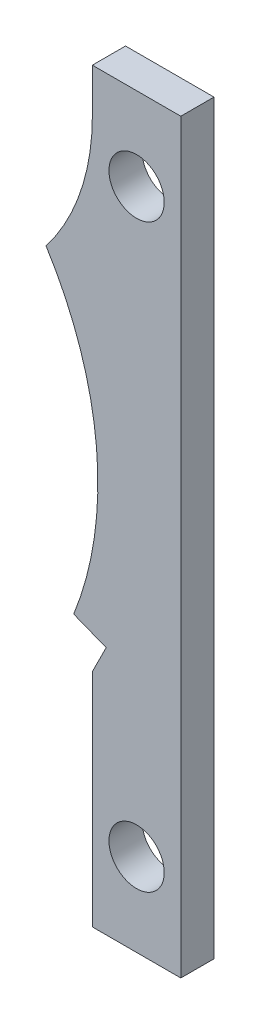
ISO-10303-21;
HEADER;
FILE_DESCRIPTION(('STEP AP214'),'2;1');
FILE_NAME('part.step','',(''),(''),'','','');
FILE_SCHEMA(('AUTOMOTIVE_DESIGN { 1 0 10303 214 1 1 1 1 }'));
ENDSEC;
DATA;
#1=APPLICATION_CONTEXT('core data for automotive mechanical design processes');
#2=APPLICATION_PROTOCOL_DEFINITION('international standard','automotive_design',2000,#1);
#3=PRODUCT_CONTEXT('',#1,'mechanical');
#4=PRODUCT('Part','Part','',(#3));
#5=PRODUCT_RELATED_PRODUCT_CATEGORY('part','',(#4));
#6=PRODUCT_DEFINITION_FORMATION('','',#4);
#7=PRODUCT_DEFINITION_CONTEXT('part definition',#1,'design');
#8=PRODUCT_DEFINITION('design','',#6,#7);
#9=PRODUCT_DEFINITION_SHAPE('','',#8);
#10=(LENGTH_UNIT() NAMED_UNIT(*) SI_UNIT(.MILLI.,.METRE.));
#11=(NAMED_UNIT(*) PLANE_ANGLE_UNIT() SI_UNIT($,.RADIAN.));
#12=(NAMED_UNIT(*) SI_UNIT($,.STERADIAN.) SOLID_ANGLE_UNIT());
#13=UNCERTAINTY_MEASURE_WITH_UNIT(LENGTH_MEASURE(1.E-05),#10,'distance_accuracy_value','');
#14=(GEOMETRIC_REPRESENTATION_CONTEXT(3) GLOBAL_UNCERTAINTY_ASSIGNED_CONTEXT((#13)) GLOBAL_UNIT_ASSIGNED_CONTEXT((#10,
#11,#12)) REPRESENTATION_CONTEXT('',''));
#15=CARTESIAN_POINT('',(0.,0.,0.));
#16=DIRECTION('',(0.,0.,1.));
#17=DIRECTION('',(1.,0.,0.));
#18=AXIS2_PLACEMENT_3D('',#15,#16,#17);
#19=CARTESIAN_POINT('',(62.5,-25.,3.));
#20=DIRECTION('',(0.367557346586308,0.930000858585858,0.));
#21=DIRECTION('',(-0.930000858585858,0.367557346586308,0.));
#22=AXIS2_PLACEMENT_3D('',#19,#20,#21);
#23=PLANE('',#22);
#24=DIRECTION('',(0.930000858585858,-0.367557346586308,0.));
#25=VECTOR('',#24,1.);
#26=CARTESIAN_POINT('',(62.5,-25.,-3.));
#27=LINE('',#26,#25);
#28=CARTESIAN_POINT('',(56.6273985543233,-22.6790152557342,-3.));
#29=VERTEX_POINT('',#28);
#30=CARTESIAN_POINT('',(62.5,-25.,-3.));
#31=VERTEX_POINT('',#30);
#32=EDGE_CURVE('E88',#29,#31,#27,.T.);
#33=ORIENTED_EDGE('',*,*,#32,.T.);
#34=DIRECTION('',(0.,0.,-1.));
#35=VECTOR('',#34,1.);
#36=CARTESIAN_POINT('',(62.5,-25.,3.));
#37=LINE('',#36,#35);
#38=CARTESIAN_POINT('',(62.5,-25.,3.));
#39=VERTEX_POINT('',#38);
#40=EDGE_CURVE('E11',#39,#31,#37,.T.);
#41=ORIENTED_EDGE('',*,*,#40,.F.);
#42=DIRECTION('',(0.930000858585858,-0.367557346586309,0.));
#43=VECTOR('',#42,1.);
#44=CARTESIAN_POINT('',(60.,-24.0119435288877,3.));
#45=LINE('',#44,#43);
#46=CARTESIAN_POINT('',(56.6273985543233,-22.6790152557342,3.));
#47=VERTEX_POINT('',#46);
#48=EDGE_CURVE('E94',#47,#39,#45,.T.);
#49=ORIENTED_EDGE('',*,*,#48,.F.);
#50=DIRECTION('',(0.,0.,-1.));
#51=VECTOR('',#50,1.);
#52=CARTESIAN_POINT('',(56.6273985543233,-22.6790152557342,3.));
#53=LINE('',#52,#51);
#54=EDGE_CURVE('E130',#47,#29,#53,.T.);
#55=ORIENTED_EDGE('',*,*,#54,.T.);
#56=EDGE_LOOP('',(#33,#41,#49,#55));
#57=FACE_BOUND('',#56,.T.);
#58=ADVANCED_FACE('F33',(#57),#23,.F.);
#59=CARTESIAN_POINT('',(62.5,-25.,3.));
#60=DIRECTION('',(0.894427190999915,-0.447213595499959,0.));
#61=DIRECTION('',(0.447213595499959,0.894427190999915,0.));
#62=AXIS2_PLACEMENT_3D('',#59,#60,#61);
#63=PLANE('',#62);
#64=DIRECTION('',(-0.447213595499959,-0.894427190999915,0.));
#65=VECTOR('',#64,1.);
#66=CARTESIAN_POINT('',(62.5,-25.,-3.));
#67=LINE('',#66,#65);
#68=CARTESIAN_POINT('',(60.,-30.,-3.));
#69=VERTEX_POINT('',#68);
#70=EDGE_CURVE('E135',#31,#69,#67,.T.);
#71=ORIENTED_EDGE('',*,*,#70,.T.);
#72=DIRECTION('',(0.,0.,-1.));
#73=VECTOR('',#72,1.);
#74=CARTESIAN_POINT('',(60.,-30.,3.));
#75=LINE('',#74,#73);
#76=CARTESIAN_POINT('',(60.,-30.,3.));
#77=VERTEX_POINT('',#76);
#78=EDGE_CURVE('E41',#77,#69,#75,.T.);
#79=ORIENTED_EDGE('',*,*,#78,.F.);
#80=DIRECTION('',(-0.447213595499959,-0.894427190999915,0.));
#81=VECTOR('',#80,1.);
#82=CARTESIAN_POINT('',(62.5,-25.,3.));
#83=LINE('',#82,#81);
#84=EDGE_CURVE('E191',#39,#77,#83,.T.);
#85=ORIENTED_EDGE('',*,*,#84,.F.);
#86=ORIENTED_EDGE('',*,*,#40,.T.);
#87=EDGE_LOOP('',(#71,#79,#85,#86));
#88=FACE_BOUND('',#87,.T.);
#89=ADVANCED_FACE('F228',(#88),#63,.F.);
#90=CARTESIAN_POINT('',(60.,-30.,3.));
#91=DIRECTION('',(1.,0.,0.));
#92=DIRECTION('',(0.,1.,0.));
#93=AXIS2_PLACEMENT_3D('',#90,#91,#92);
#94=PLANE('',#93);
#95=DIRECTION('',(0.,-1.,0.));
#96=VECTOR('',#95,1.);
#97=CARTESIAN_POINT('',(60.,-30.,-3.));
#98=LINE('',#97,#96);
#99=CARTESIAN_POINT('',(60.,-70.,-3.));
#100=VERTEX_POINT('',#99);
#101=EDGE_CURVE('E138',#69,#100,#98,.T.);
#102=ORIENTED_EDGE('',*,*,#101,.T.);
#103=DIRECTION('',(0.,0.,-1.));
#104=VECTOR('',#103,1.);
#105=CARTESIAN_POINT('',(60.,-70.,3.));
#106=LINE('',#105,#104);
#107=CARTESIAN_POINT('',(60.,-70.,3.));
#108=VERTEX_POINT('',#107);
#109=EDGE_CURVE('E162',#108,#100,#106,.T.);
#110=ORIENTED_EDGE('',*,*,#109,.F.);
#111=DIRECTION('',(0.,-1.,0.));
#112=VECTOR('',#111,1.);
#113=CARTESIAN_POINT('',(60.,-30.,3.));
#114=LINE('',#113,#112);
#115=EDGE_CURVE('E171',#77,#108,#114,.T.);
#116=ORIENTED_EDGE('',*,*,#115,.F.);
#117=ORIENTED_EDGE('',*,*,#78,.T.);
#118=EDGE_LOOP('',(#102,#110,#116,#117));
#119=FACE_BOUND('',#118,.T.);
#120=ADVANCED_FACE('F169',(#119),#94,.F.);
#121=CARTESIAN_POINT('',(60.,-70.,3.));
#122=DIRECTION('',(0.,1.,0.));
#123=DIRECTION('',(0.,0.,1.));
#124=AXIS2_PLACEMENT_3D('',#121,#122,#123);
#125=PLANE('',#124);
#126=DIRECTION('',(1.,0.,0.));
#127=VECTOR('',#126,1.);
#128=CARTESIAN_POINT('',(60.,-70.,-3.));
#129=LINE('',#128,#127);
#130=CARTESIAN_POINT('',(75.9999970794949,-70.,-3.));
#131=VERTEX_POINT('',#130);
#132=EDGE_CURVE('E140',#100,#131,#129,.T.);
#133=ORIENTED_EDGE('',*,*,#132,.T.);
#134=DIRECTION('',(0.,0.,-1.));
#135=VECTOR('',#134,1.);
#136=CARTESIAN_POINT('',(75.9999970794949,-70.,3.));
#137=LINE('',#136,#135);
#138=CARTESIAN_POINT('',(75.9999970794949,-70.,3.));
#139=VERTEX_POINT('',#138);
#140=EDGE_CURVE('E159',#139,#131,#137,.T.);
#141=ORIENTED_EDGE('',*,*,#140,.F.);
#142=DIRECTION('',(1.,0.,0.));
#143=VECTOR('',#142,1.);
#144=CARTESIAN_POINT('',(60.,-70.,3.));
#145=LINE('',#144,#143);
#146=EDGE_CURVE('E186',#108,#139,#145,.T.);
#147=ORIENTED_EDGE('',*,*,#146,.F.);
#148=ORIENTED_EDGE('',*,*,#109,.T.);
#149=EDGE_LOOP('',(#133,#141,#147,#148));
#150=FACE_BOUND('',#149,.T.);
#151=ADVANCED_FACE('F179',(#150),#125,.F.);
#152=CARTESIAN_POINT('',(75.9999970794949,65.,3.));
#153=DIRECTION('',(-1.,0.,0.));
#154=DIRECTION('',(0.,0.,1.));
#155=AXIS2_PLACEMENT_3D('',#152,#153,#154);
#156=PLANE('',#155);
#157=DIRECTION('',(0.,1.,0.));
#158=VECTOR('',#157,1.);
#159=CARTESIAN_POINT('',(75.9999970794949,65.,-3.));
#160=LINE('',#159,#158);
#161=CARTESIAN_POINT('',(75.9999970794949,65.,-3.));
#162=VERTEX_POINT('',#161);
#163=EDGE_CURVE('E143',#131,#162,#160,.T.);
#164=ORIENTED_EDGE('',*,*,#163,.T.);
#165=DIRECTION('',(0.,0.,-1.));
#166=VECTOR('',#165,1.);
#167=CARTESIAN_POINT('',(75.9999970794949,65.,3.));
#168=LINE('',#167,#166);
#169=CARTESIAN_POINT('',(75.9999970794949,65.,3.));
#170=VERTEX_POINT('',#169);
#171=EDGE_CURVE('E156',#170,#162,#168,.T.);
#172=ORIENTED_EDGE('',*,*,#171,.F.);
#173=DIRECTION('',(0.,1.,0.));
#174=VECTOR('',#173,1.);
#175=CARTESIAN_POINT('',(75.9999970794949,-70.,3.));
#176=LINE('',#175,#174);
#177=EDGE_CURVE('E185',#139,#170,#176,.T.);
#178=ORIENTED_EDGE('',*,*,#177,.F.);
#179=ORIENTED_EDGE('',*,*,#140,.T.);
#180=EDGE_LOOP('',(#164,#172,#178,#179));
#181=FACE_BOUND('',#180,.T.);
#182=ADVANCED_FACE('F183',(#181),#156,.F.);
#183=CARTESIAN_POINT('',(59.9999970794949,65.,3.));
#184=DIRECTION('',(0.,-1.,0.));
#185=DIRECTION('',(0.,0.,-1.));
#186=AXIS2_PLACEMENT_3D('',#183,#184,#185);
#187=PLANE('',#186);
#188=DIRECTION('',(-1.,0.,0.));
#189=VECTOR('',#188,1.);
#190=CARTESIAN_POINT('',(59.9999970794949,65.,-3.));
#191=LINE('',#190,#189);
#192=CARTESIAN_POINT('',(59.9999970794949,65.,-3.));
#193=VERTEX_POINT('',#192);
#194=EDGE_CURVE('E145',#162,#193,#191,.T.);
#195=ORIENTED_EDGE('',*,*,#194,.T.);
#196=DIRECTION('',(0.,0.,-1.));
#197=VECTOR('',#196,1.);
#198=CARTESIAN_POINT('',(59.9999970794949,65.,3.));
#199=LINE('',#198,#197);
#200=CARTESIAN_POINT('',(59.9999970794949,65.,3.));
#201=VERTEX_POINT('',#200);
#202=EDGE_CURVE('E125',#201,#193,#199,.T.);
#203=ORIENTED_EDGE('',*,*,#202,.F.);
#204=DIRECTION('',(-1.,0.,0.));
#205=VECTOR('',#204,1.);
#206=CARTESIAN_POINT('',(59.9999970794949,65.,3.));
#207=LINE('',#206,#205);
#208=EDGE_CURVE('E117',#170,#201,#207,.T.);
#209=ORIENTED_EDGE('',*,*,#208,.F.);
#210=ORIENTED_EDGE('',*,*,#171,.T.);
#211=EDGE_LOOP('',(#195,#203,#209,#210));
#212=FACE_BOUND('',#211,.T.);
#213=ADVANCED_FACE('F235',(#212),#187,.F.);
#214=CARTESIAN_POINT('',(59.9999970794949,62.,3.));
#215=DIRECTION('',(1.,0.,0.));
#216=DIRECTION('',(0.,1.,0.));
#217=AXIS2_PLACEMENT_3D('',#214,#215,#216);
#218=PLANE('',#217);
#219=DIRECTION('',(0.,-1.,0.));
#220=VECTOR('',#219,1.);
#221=CARTESIAN_POINT('',(59.9999970794949,62.,-3.));
#222=LINE('',#221,#220);
#223=CARTESIAN_POINT('',(59.9999970794949,57.,-3.));
#224=VERTEX_POINT('',#223);
#225=EDGE_CURVE('E124',#193,#224,#222,.T.);
#226=ORIENTED_EDGE('',*,*,#225,.T.);
#227=DIRECTION('',(0.,0.,-1.));
#228=VECTOR('',#227,1.);
#229=CARTESIAN_POINT('',(59.9999970794949,57.,3.));
#230=LINE('',#229,#228);
#231=CARTESIAN_POINT('',(59.9999970794949,57.,3.));
#232=VERTEX_POINT('',#231);
#233=EDGE_CURVE('E122',#232,#224,#230,.T.);
#234=ORIENTED_EDGE('',*,*,#233,.F.);
#235=DIRECTION('',(0.,-1.,0.));
#236=VECTOR('',#235,1.);
#237=CARTESIAN_POINT('',(59.9999970794949,62.,3.));
#238=LINE('',#237,#236);
#239=EDGE_CURVE('E111',#201,#232,#238,.T.);
#240=ORIENTED_EDGE('',*,*,#239,.F.);
#241=ORIENTED_EDGE('',*,*,#202,.T.);
#242=EDGE_LOOP('',(#226,#234,#240,#241));
#243=FACE_BOUND('',#242,.T.);
#244=ADVANCED_FACE('F123',(#243),#218,.F.);
#245=CARTESIAN_POINT('',(19.9999970794949,57.,3.));
#246=DIRECTION('',(0.,0.,-1.));
#247=DIRECTION('',(-1.,0.,0.));
#248=AXIS2_PLACEMENT_3D('',#245,#246,#247);
#249=CYLINDRICAL_SURFACE('',#248,40.);
#250=CARTESIAN_POINT('',(19.9999970794949,57.,-3.));
#251=DIRECTION('',(0.,0.,-1.));
#252=DIRECTION('',(1.,0.,0.));
#253=AXIS2_PLACEMENT_3D('',#250,#251,#252);
#254=CIRCLE('',#253,40.);
#255=CARTESIAN_POINT('',(51.6201424375097,32.5017060280104,-3.));
#256=VERTEX_POINT('',#255);
#257=EDGE_CURVE('E81',#224,#256,#254,.T.);
#258=ORIENTED_EDGE('',*,*,#257,.T.);
#259=DIRECTION('',(0.,0.,-1.));
#260=VECTOR('',#259,1.);
#261=CARTESIAN_POINT('',(51.6201424375097,32.5017060280104,3.));
#262=LINE('',#261,#260);
#263=CARTESIAN_POINT('',(51.6201424375097,32.5017060280104,3.));
#264=VERTEX_POINT('',#263);
#265=EDGE_CURVE('E126',#264,#256,#262,.T.);
#266=ORIENTED_EDGE('',*,*,#265,.F.);
#267=CARTESIAN_POINT('',(19.9999970794949,57.,3.));
#268=DIRECTION('',(0.,0.,-1.));
#269=DIRECTION('',(1.,0.,0.));
#270=AXIS2_PLACEMENT_3D('',#267,#268,#269);
#271=CIRCLE('',#270,40.);
#272=EDGE_CURVE('E115',#232,#264,#271,.T.);
#273=ORIENTED_EDGE('',*,*,#272,.F.);
#274=ORIENTED_EDGE('',*,*,#233,.T.);
#275=EDGE_LOOP('',(#258,#266,#273,#274));
#276=FACE_BOUND('',#275,.T.);
#277=ADVANCED_FACE('F128',(#276),#249,.F.);
#278=CARTESIAN_POINT('',(0.,0.,3.));
#279=DIRECTION('',(0.,0.,-1.));
#280=DIRECTION('',(-1.,0.,0.));
#281=AXIS2_PLACEMENT_3D('',#278,#279,#280);
#282=CYLINDRICAL_SURFACE('',#281,61.);
#283=CARTESIAN_POINT('',(0.,0.,-3.));
#284=DIRECTION('',(0.,0.,-1.));
#285=DIRECTION('',(1.,0.,0.));
#286=AXIS2_PLACEMENT_3D('',#283,#284,#285);
#287=CIRCLE('',#286,61.);
#288=EDGE_CURVE('E150',#256,#29,#287,.T.);
#289=ORIENTED_EDGE('',*,*,#288,.T.);
#290=ORIENTED_EDGE('',*,*,#54,.F.);
#291=CARTESIAN_POINT('',(0.,0.,3.));
#292=DIRECTION('',(0.,0.,-1.));
#293=DIRECTION('',(1.,0.,0.));
#294=AXIS2_PLACEMENT_3D('',#291,#292,#293);
#295=CIRCLE('',#294,61.);
#296=EDGE_CURVE('E49',#264,#47,#295,.T.);
#297=ORIENTED_EDGE('',*,*,#296,.F.);
#298=ORIENTED_EDGE('',*,*,#265,.T.);
#299=EDGE_LOOP('',(#289,#290,#297,#298));
#300=FACE_BOUND('',#299,.T.);
#301=ADVANCED_FACE('F210',(#300),#282,.F.);
#302=CARTESIAN_POINT('',(0.,0.,3.));
#303=DIRECTION('',(0.,0.,1.));
#304=DIRECTION('',(1.,0.,0.));
#305=AXIS2_PLACEMENT_3D('',#302,#303,#304);
#306=PLANE('',#305);
#307=CARTESIAN_POINT('',(67.9999970794949,50.,3.));
#308=DIRECTION('',(0.,0.,1.));
#309=DIRECTION('',(1.,0.,0.));
#310=AXIS2_PLACEMENT_3D('',#307,#308,#309);
#311=CIRCLE('',#310,5.);
#312=CARTESIAN_POINT('',(72.9999970794949,50.,3.));
#313=VERTEX_POINT('',#312);
#314=EDGE_CURVE('E202',#313,#313,#311,.T.);
#315=ORIENTED_EDGE('',*,*,#314,.F.);
#316=EDGE_LOOP('',(#315));
#317=FACE_BOUND('',#316,.T.);
#318=CARTESIAN_POINT('',(67.9999970794949,-55.,3.));
#319=DIRECTION('',(0.,0.,1.));
#320=DIRECTION('',(1.,0.,0.));
#321=AXIS2_PLACEMENT_3D('',#318,#319,#320);
#322=CIRCLE('',#321,5.);
#323=CARTESIAN_POINT('',(72.9999970794949,-55.,3.));
#324=VERTEX_POINT('',#323);
#325=EDGE_CURVE('E196',#324,#324,#322,.T.);
#326=ORIENTED_EDGE('',*,*,#325,.F.);
#327=EDGE_LOOP('',(#326));
#328=FACE_BOUND('',#327,.T.);
#329=ORIENTED_EDGE('',*,*,#48,.T.);
#330=ORIENTED_EDGE('',*,*,#84,.T.);
#331=ORIENTED_EDGE('',*,*,#115,.T.);
#332=ORIENTED_EDGE('',*,*,#146,.T.);
#333=ORIENTED_EDGE('',*,*,#177,.T.);
#334=ORIENTED_EDGE('',*,*,#208,.T.);
#335=ORIENTED_EDGE('',*,*,#239,.T.);
#336=ORIENTED_EDGE('',*,*,#272,.T.);
#337=ORIENTED_EDGE('',*,*,#296,.T.);
#338=EDGE_LOOP('',(#329,#330,#331,#332,#333,#334,#335,#336,#337));
#339=FACE_BOUND('',#338,.T.);
#340=ADVANCED_FACE('F113',(#317,#328,#339),#306,.T.);
#341=CARTESIAN_POINT('',(0.,0.,-3.));
#342=DIRECTION('',(0.,0.,1.));
#343=DIRECTION('',(1.,0.,0.));
#344=AXIS2_PLACEMENT_3D('',#341,#342,#343);
#345=PLANE('',#344);
#346=CARTESIAN_POINT('',(67.9999970794949,50.,-3.));
#347=DIRECTION('',(0.,0.,1.));
#348=DIRECTION('',(1.,0.,0.));
#349=AXIS2_PLACEMENT_3D('',#346,#347,#348);
#350=CIRCLE('',#349,5.);
#351=CARTESIAN_POINT('',(72.9999970794949,50.,-3.));
#352=VERTEX_POINT('',#351);
#353=EDGE_CURVE('E199',#352,#352,#350,.T.);
#354=ORIENTED_EDGE('',*,*,#353,.T.);
#355=EDGE_LOOP('',(#354));
#356=FACE_BOUND('',#355,.T.);
#357=CARTESIAN_POINT('',(67.9999970794949,-55.,-3.));
#358=DIRECTION('',(0.,0.,1.));
#359=DIRECTION('',(1.,0.,0.));
#360=AXIS2_PLACEMENT_3D('',#357,#358,#359);
#361=CIRCLE('',#360,5.);
#362=CARTESIAN_POINT('',(72.9999970794949,-55.,-3.));
#363=VERTEX_POINT('',#362);
#364=EDGE_CURVE('E136',#363,#363,#361,.T.);
#365=ORIENTED_EDGE('',*,*,#364,.T.);
#366=EDGE_LOOP('',(#365));
#367=FACE_BOUND('',#366,.T.);
#368=ORIENTED_EDGE('',*,*,#32,.F.);
#369=ORIENTED_EDGE('',*,*,#288,.F.);
#370=ORIENTED_EDGE('',*,*,#257,.F.);
#371=ORIENTED_EDGE('',*,*,#225,.F.);
#372=ORIENTED_EDGE('',*,*,#194,.F.);
#373=ORIENTED_EDGE('',*,*,#163,.F.);
#374=ORIENTED_EDGE('',*,*,#132,.F.);
#375=ORIENTED_EDGE('',*,*,#101,.F.);
#376=ORIENTED_EDGE('',*,*,#70,.F.);
#377=EDGE_LOOP('',(#368,#369,#370,#371,#372,#373,#374,#375,#376));
#378=FACE_BOUND('',#377,.T.);
#379=ADVANCED_FACE('F175',(#356,#367,#378),#345,.F.);
#380=CARTESIAN_POINT('',(67.9999970794949,-55.,3.));
#381=DIRECTION('',(0.,0.,1.));
#382=DIRECTION('',(1.,0.,0.));
#383=AXIS2_PLACEMENT_3D('',#380,#381,#382);
#384=CYLINDRICAL_SURFACE('',#383,5.);
#385=ORIENTED_EDGE('',*,*,#364,.F.);
#386=EDGE_LOOP('',(#385));
#387=FACE_BOUND('',#386,.T.);
#388=ORIENTED_EDGE('',*,*,#325,.T.);
#389=EDGE_LOOP('',(#388));
#390=FACE_BOUND('',#389,.T.);
#391=ADVANCED_FACE('F214',(#387,#390),#384,.F.);
#392=CARTESIAN_POINT('',(67.9999970794949,50.,3.));
#393=DIRECTION('',(0.,0.,1.));
#394=DIRECTION('',(1.,0.,0.));
#395=AXIS2_PLACEMENT_3D('',#392,#393,#394);
#396=CYLINDRICAL_SURFACE('',#395,5.);
#397=ORIENTED_EDGE('',*,*,#353,.F.);
#398=EDGE_LOOP('',(#397));
#399=FACE_BOUND('',#398,.T.);
#400=ORIENTED_EDGE('',*,*,#314,.T.);
#401=EDGE_LOOP('',(#400));
#402=FACE_BOUND('',#401,.T.);
#403=ADVANCED_FACE('F206',(#399,#402),#396,.F.);
#404=CLOSED_SHELL('',(#58,#89,#120,#151,#182,#213,#244,#277,#301,#340,#379,#391,#403));
#405=MANIFOLD_SOLID_BREP('B2',#404);
#406=ADVANCED_BREP_SHAPE_REPRESENTATION('',(#18,#405),#14);
#407=SHAPE_DEFINITION_REPRESENTATION(#9,#406);
ENDSEC;
END-ISO-10303-21;
